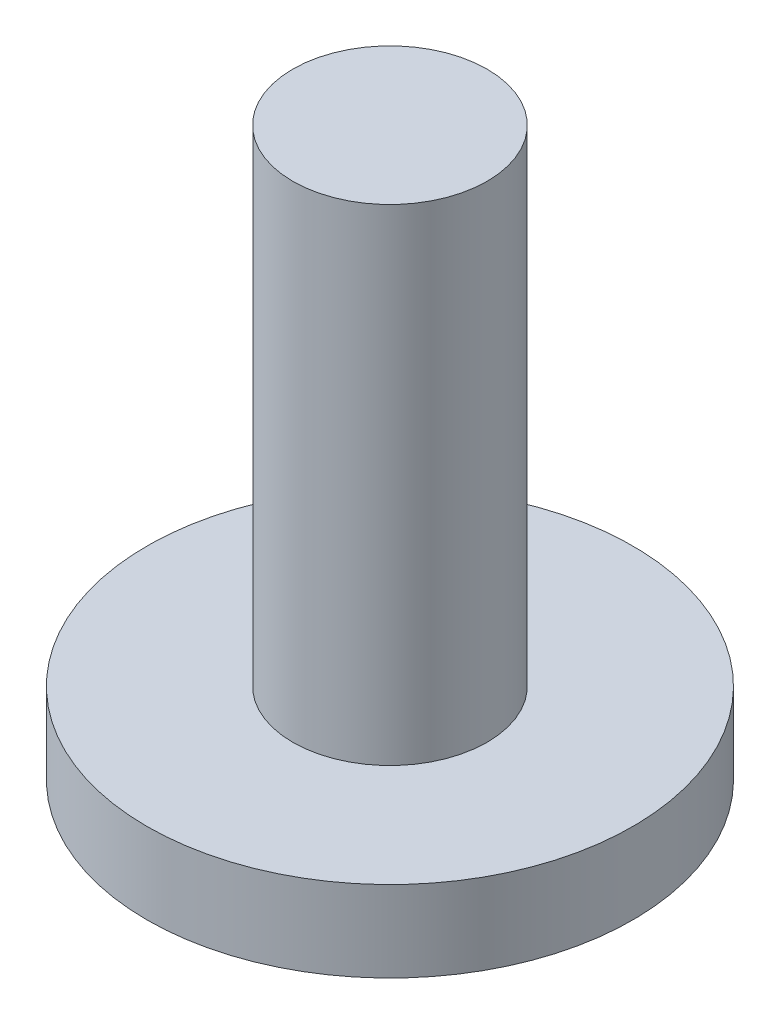
ISO-10303-21;
HEADER;
FILE_DESCRIPTION(('STEP AP214'),'2;1');
FILE_NAME('part.step','',(''),(''),'','','');
FILE_SCHEMA(('AUTOMOTIVE_DESIGN { 1 0 10303 214 1 1 1 1 }'));
ENDSEC;
DATA;
#1=APPLICATION_CONTEXT('core data for automotive mechanical design processes');
#2=APPLICATION_PROTOCOL_DEFINITION('international standard','automotive_design',2000,#1);
#3=PRODUCT_CONTEXT('',#1,'mechanical');
#4=PRODUCT('Part','Part','',(#3));
#5=PRODUCT_RELATED_PRODUCT_CATEGORY('part','',(#4));
#6=PRODUCT_DEFINITION_FORMATION('','',#4);
#7=PRODUCT_DEFINITION_CONTEXT('part definition',#1,'design');
#8=PRODUCT_DEFINITION('design','',#6,#7);
#9=PRODUCT_DEFINITION_SHAPE('','',#8);
#10=(LENGTH_UNIT() NAMED_UNIT(*) SI_UNIT(.MILLI.,.METRE.));
#11=(NAMED_UNIT(*) PLANE_ANGLE_UNIT() SI_UNIT($,.RADIAN.));
#12=(NAMED_UNIT(*) SI_UNIT($,.STERADIAN.) SOLID_ANGLE_UNIT());
#13=UNCERTAINTY_MEASURE_WITH_UNIT(LENGTH_MEASURE(1.E-05),#10,'distance_accuracy_value','');
#14=(GEOMETRIC_REPRESENTATION_CONTEXT(3) GLOBAL_UNCERTAINTY_ASSIGNED_CONTEXT((#13)) GLOBAL_UNIT_ASSIGNED_CONTEXT((#10,
#11,#12)) REPRESENTATION_CONTEXT('',''));
#15=CARTESIAN_POINT('',(0.,0.,0.));
#16=DIRECTION('',(0.,0.,1.));
#17=DIRECTION('',(1.,0.,0.));
#18=AXIS2_PLACEMENT_3D('',#15,#16,#17);
#19=CARTESIAN_POINT('',(0.,1.,0.));
#20=DIRECTION('',(0.,-1.,0.));
#21=DIRECTION('',(0.,0.,-1.));
#22=AXIS2_PLACEMENT_3D('',#19,#20,#21);
#23=CYLINDRICAL_SURFACE('',#22,3.);
#24=CARTESIAN_POINT('',(0.,1.,0.));
#25=DIRECTION('',(0.,1.,0.));
#26=DIRECTION('',(0.,0.,1.));
#27=AXIS2_PLACEMENT_3D('',#24,#25,#26);
#28=CIRCLE('',#27,3.);
#29=CARTESIAN_POINT('',(0.,1.,3.));
#30=VERTEX_POINT('',#29);
#31=EDGE_CURVE('E10',#30,#30,#28,.T.);
#32=ORIENTED_EDGE('',*,*,#31,.F.);
#33=EDGE_LOOP('',(#32));
#34=FACE_BOUND('',#33,.T.);
#35=CARTESIAN_POINT('',(0.,0.,0.));
#36=DIRECTION('',(0.,1.,0.));
#37=DIRECTION('',(0.,0.,1.));
#38=AXIS2_PLACEMENT_3D('',#35,#36,#37);
#39=CIRCLE('',#38,3.);
#40=CARTESIAN_POINT('',(0.,0.,3.));
#41=VERTEX_POINT('',#40);
#42=EDGE_CURVE('E34',#41,#41,#39,.T.);
#43=ORIENTED_EDGE('',*,*,#42,.T.);
#44=EDGE_LOOP('',(#43));
#45=FACE_BOUND('',#44,.T.);
#46=ADVANCED_FACE('F31',(#34,#45),#23,.T.);
#47=CARTESIAN_POINT('',(0.,1.,0.));
#48=DIRECTION('',(0.,1.,0.));
#49=DIRECTION('',(0.,0.,1.));
#50=AXIS2_PLACEMENT_3D('',#47,#48,#49);
#51=PLANE('',#50);
#52=CARTESIAN_POINT('',(0.,1.,0.));
#53=DIRECTION('',(0.,1.,0.));
#54=DIRECTION('',(0.,0.,1.));
#55=AXIS2_PLACEMENT_3D('',#52,#53,#54);
#56=CIRCLE('',#55,1.2);
#57=CARTESIAN_POINT('',(0.,1.,1.2));
#58=VERTEX_POINT('',#57);
#59=EDGE_CURVE('E43',#58,#58,#56,.T.);
#60=ORIENTED_EDGE('',*,*,#59,.F.);
#61=EDGE_LOOP('',(#60));
#62=FACE_BOUND('',#61,.T.);
#63=ORIENTED_EDGE('',*,*,#31,.T.);
#64=EDGE_LOOP('',(#63));
#65=FACE_BOUND('',#64,.T.);
#66=ADVANCED_FACE('F58',(#62,#65),#51,.T.);
#67=CARTESIAN_POINT('',(0.,0.,0.));
#68=DIRECTION('',(0.,1.,0.));
#69=DIRECTION('',(0.,0.,1.));
#70=AXIS2_PLACEMENT_3D('',#67,#68,#69);
#71=PLANE('',#70);
#72=ORIENTED_EDGE('',*,*,#42,.F.);
#73=EDGE_LOOP('',(#72));
#74=FACE_BOUND('',#73,.T.);
#75=ADVANCED_FACE('F54',(#74),#71,.F.);
#76=CARTESIAN_POINT('',(0.,7.,0.));
#77=DIRECTION('',(0.,-1.,0.));
#78=DIRECTION('',(0.,0.,-1.));
#79=AXIS2_PLACEMENT_3D('',#76,#77,#78);
#80=CYLINDRICAL_SURFACE('',#79,1.2);
#81=CARTESIAN_POINT('',(0.,7.,0.));
#82=DIRECTION('',(0.,1.,0.));
#83=DIRECTION('',(0.,0.,1.));
#84=AXIS2_PLACEMENT_3D('',#81,#82,#83);
#85=CIRCLE('',#84,1.2);
#86=CARTESIAN_POINT('',(0.,7.,1.2));
#87=VERTEX_POINT('',#86);
#88=EDGE_CURVE('E41',#87,#87,#85,.T.);
#89=ORIENTED_EDGE('',*,*,#88,.F.);
#90=EDGE_LOOP('',(#89));
#91=FACE_BOUND('',#90,.T.);
#92=ORIENTED_EDGE('',*,*,#59,.T.);
#93=EDGE_LOOP('',(#92));
#94=FACE_BOUND('',#93,.T.);
#95=ADVANCED_FACE('F51',(#91,#94),#80,.T.);
#96=CARTESIAN_POINT('',(0.,7.,0.));
#97=DIRECTION('',(0.,1.,0.));
#98=DIRECTION('',(0.,0.,1.));
#99=AXIS2_PLACEMENT_3D('',#96,#97,#98);
#100=PLANE('',#99);
#101=ORIENTED_EDGE('',*,*,#88,.T.);
#102=EDGE_LOOP('',(#101));
#103=FACE_BOUND('',#102,.T.);
#104=ADVANCED_FACE('F49',(#103),#100,.T.);
#105=CLOSED_SHELL('',(#46,#66,#75,#95,#104));
#106=MANIFOLD_SOLID_BREP('B2',#105);
#107=ADVANCED_BREP_SHAPE_REPRESENTATION('',(#18,#106),#14);
#108=SHAPE_DEFINITION_REPRESENTATION(#9,#107);
ENDSEC;
END-ISO-10303-21;
